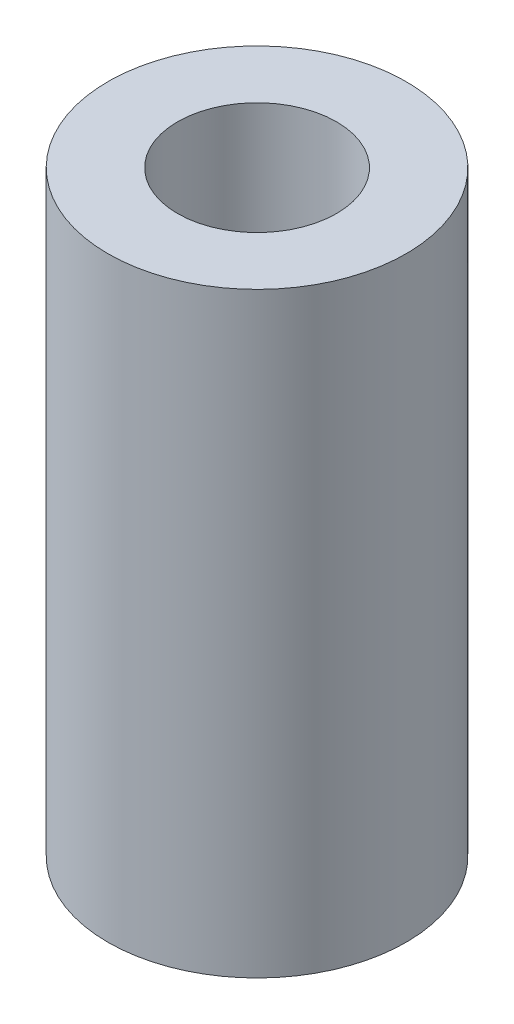
ISO-10303-21;
HEADER;
FILE_DESCRIPTION(('STEP AP214'),'2;1');
FILE_NAME('part.step','',(''),(''),'','','');
FILE_SCHEMA(('AUTOMOTIVE_DESIGN { 1 0 10303 214 1 1 1 1 }'));
ENDSEC;
DATA;
#1=APPLICATION_CONTEXT('core data for automotive mechanical design processes');
#2=APPLICATION_PROTOCOL_DEFINITION('international standard','automotive_design',2000,#1);
#3=PRODUCT_CONTEXT('',#1,'mechanical');
#4=PRODUCT('Part','Part','',(#3));
#5=PRODUCT_RELATED_PRODUCT_CATEGORY('part','',(#4));
#6=PRODUCT_DEFINITION_FORMATION('','',#4);
#7=PRODUCT_DEFINITION_CONTEXT('part definition',#1,'design');
#8=PRODUCT_DEFINITION('design','',#6,#7);
#9=PRODUCT_DEFINITION_SHAPE('','',#8);
#10=(LENGTH_UNIT() NAMED_UNIT(*) SI_UNIT(.MILLI.,.METRE.));
#11=(NAMED_UNIT(*) PLANE_ANGLE_UNIT() SI_UNIT($,.RADIAN.));
#12=(NAMED_UNIT(*) SI_UNIT($,.STERADIAN.) SOLID_ANGLE_UNIT());
#13=UNCERTAINTY_MEASURE_WITH_UNIT(LENGTH_MEASURE(1.E-05),#10,'distance_accuracy_value','');
#14=(GEOMETRIC_REPRESENTATION_CONTEXT(3) GLOBAL_UNCERTAINTY_ASSIGNED_CONTEXT((#13)) GLOBAL_UNIT_ASSIGNED_CONTEXT((#10,
#11,#12)) REPRESENTATION_CONTEXT('',''));
#15=CARTESIAN_POINT('',(0.,0.,0.));
#16=DIRECTION('',(0.,0.,1.));
#17=DIRECTION('',(1.,0.,0.));
#18=AXIS2_PLACEMENT_3D('',#15,#16,#17);
#19=CARTESIAN_POINT('',(0.,6.,0.));
#20=DIRECTION('',(0.,1.,0.));
#21=DIRECTION('',(0.,0.,1.));
#22=AXIS2_PLACEMENT_3D('',#19,#20,#21);
#23=PLANE('',#22);
#24=CARTESIAN_POINT('',(0.,6.,0.));
#25=DIRECTION('',(0.,1.,0.));
#26=DIRECTION('',(0.,0.,1.));
#27=AXIS2_PLACEMENT_3D('',#24,#25,#26);
#28=CIRCLE('',#27,3.);
#29=CARTESIAN_POINT('',(0.,6.,3.));
#30=VERTEX_POINT('',#29);
#31=EDGE_CURVE('E10',#30,#30,#28,.T.);
#32=ORIENTED_EDGE('',*,*,#31,.T.);
#33=EDGE_LOOP('',(#32));
#34=FACE_BOUND('',#33,.T.);
#35=CARTESIAN_POINT('',(0.,6.,0.));
#36=DIRECTION('',(0.,1.,0.));
#37=DIRECTION('',(0.,0.,1.));
#38=AXIS2_PLACEMENT_3D('',#35,#36,#37);
#39=CIRCLE('',#38,1.6);
#40=CARTESIAN_POINT('',(0.,6.,1.6));
#41=VERTEX_POINT('',#40);
#42=EDGE_CURVE('E50',#41,#41,#39,.T.);
#43=ORIENTED_EDGE('',*,*,#42,.F.);
#44=EDGE_LOOP('',(#43));
#45=FACE_BOUND('',#44,.T.);
#46=ADVANCED_FACE('F37',(#34,#45),#23,.T.);
#47=CARTESIAN_POINT('',(0.,-6.,0.));
#48=DIRECTION('',(0.,1.,0.));
#49=DIRECTION('',(0.,0.,1.));
#50=AXIS2_PLACEMENT_3D('',#47,#48,#49);
#51=PLANE('',#50);
#52=CARTESIAN_POINT('',(0.,-6.,0.));
#53=DIRECTION('',(0.,1.,0.));
#54=DIRECTION('',(0.,0.,1.));
#55=AXIS2_PLACEMENT_3D('',#52,#53,#54);
#56=CIRCLE('',#55,3.);
#57=CARTESIAN_POINT('',(0.,-6.,3.));
#58=VERTEX_POINT('',#57);
#59=EDGE_CURVE('E41',#58,#58,#56,.T.);
#60=ORIENTED_EDGE('',*,*,#59,.F.);
#61=EDGE_LOOP('',(#60));
#62=FACE_BOUND('',#61,.T.);
#63=CARTESIAN_POINT('',(0.,-6.,0.));
#64=DIRECTION('',(0.,1.,0.));
#65=DIRECTION('',(0.,0.,1.));
#66=AXIS2_PLACEMENT_3D('',#63,#64,#65);
#67=CIRCLE('',#66,1.6);
#68=CARTESIAN_POINT('',(0.,-6.,1.6));
#69=VERTEX_POINT('',#68);
#70=EDGE_CURVE('E52',#69,#69,#67,.T.);
#71=ORIENTED_EDGE('',*,*,#70,.T.);
#72=EDGE_LOOP('',(#71));
#73=FACE_BOUND('',#72,.T.);
#74=ADVANCED_FACE('F64',(#62,#73),#51,.F.);
#75=CARTESIAN_POINT('',(0.,6.,0.));
#76=DIRECTION('',(0.,-1.,0.));
#77=DIRECTION('',(0.,0.,-1.));
#78=AXIS2_PLACEMENT_3D('',#75,#76,#77);
#79=CYLINDRICAL_SURFACE('',#78,3.);
#80=ORIENTED_EDGE('',*,*,#31,.F.);
#81=EDGE_LOOP('',(#80));
#82=FACE_BOUND('',#81,.T.);
#83=ORIENTED_EDGE('',*,*,#59,.T.);
#84=EDGE_LOOP('',(#83));
#85=FACE_BOUND('',#84,.T.);
#86=ADVANCED_FACE('F39',(#82,#85),#79,.T.);
#87=CARTESIAN_POINT('',(0.,6.,0.));
#88=DIRECTION('',(0.,-1.,0.));
#89=DIRECTION('',(0.,0.,-1.));
#90=AXIS2_PLACEMENT_3D('',#87,#88,#89);
#91=CYLINDRICAL_SURFACE('',#90,1.6);
#92=ORIENTED_EDGE('',*,*,#42,.T.);
#93=EDGE_LOOP('',(#92));
#94=FACE_BOUND('',#93,.T.);
#95=ORIENTED_EDGE('',*,*,#70,.F.);
#96=EDGE_LOOP('',(#95));
#97=FACE_BOUND('',#96,.T.);
#98=ADVANCED_FACE('F60',(#94,#97),#91,.F.);
#99=CLOSED_SHELL('',(#46,#74,#86,#98));
#100=MANIFOLD_SOLID_BREP('B2',#99);
#101=ADVANCED_BREP_SHAPE_REPRESENTATION('',(#18,#100),#14);
#102=SHAPE_DEFINITION_REPRESENTATION(#9,#101);
ENDSEC;
END-ISO-10303-21;
